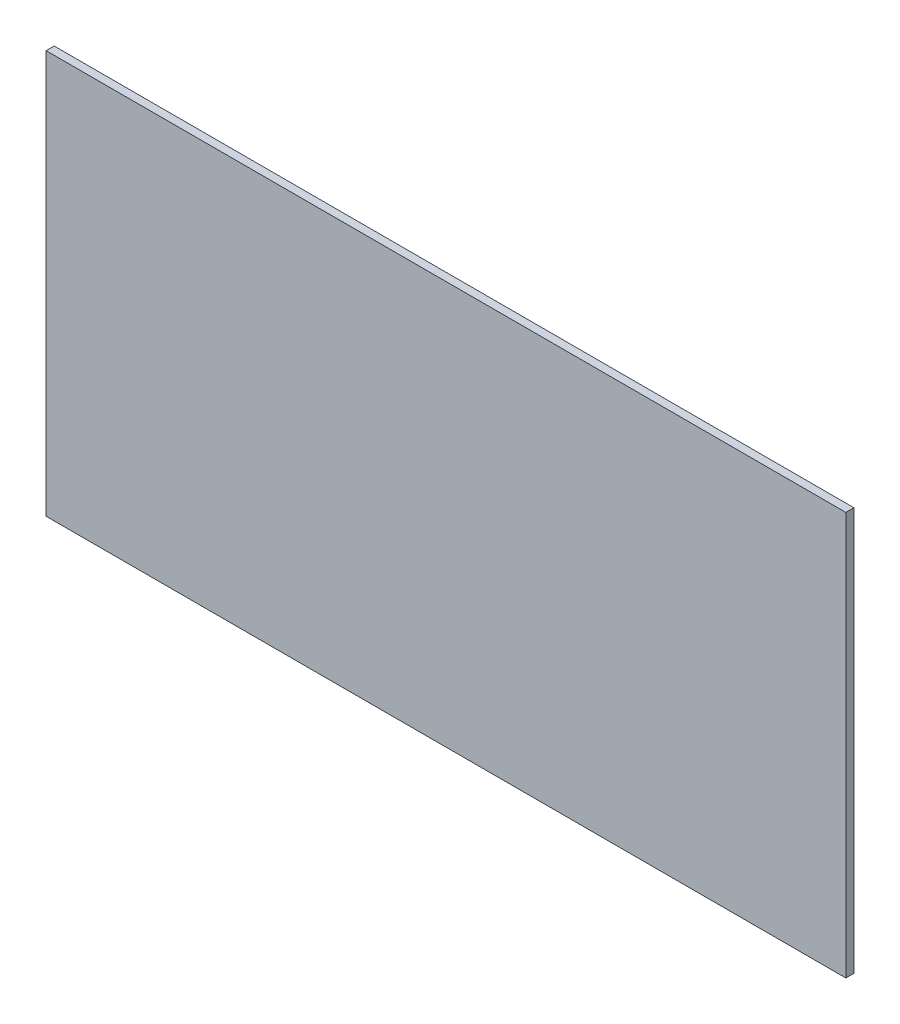
ISO-10303-21;
HEADER;
FILE_DESCRIPTION(('STEP AP214'),'2;1');
FILE_NAME('part.step','',(''),(''),'','','');
FILE_SCHEMA(('AUTOMOTIVE_DESIGN { 1 0 10303 214 1 1 1 1 }'));
ENDSEC;
DATA;
#1=APPLICATION_CONTEXT('core data for automotive mechanical design processes');
#2=APPLICATION_PROTOCOL_DEFINITION('international standard','automotive_design',2000,#1);
#3=PRODUCT_CONTEXT('',#1,'mechanical');
#4=PRODUCT('Part','Part','',(#3));
#5=PRODUCT_RELATED_PRODUCT_CATEGORY('part','',(#4));
#6=PRODUCT_DEFINITION_FORMATION('','',#4);
#7=PRODUCT_DEFINITION_CONTEXT('part definition',#1,'design');
#8=PRODUCT_DEFINITION('design','',#6,#7);
#9=PRODUCT_DEFINITION_SHAPE('','',#8);
#10=(LENGTH_UNIT() NAMED_UNIT(*) SI_UNIT(.MILLI.,.METRE.));
#11=(NAMED_UNIT(*) PLANE_ANGLE_UNIT() SI_UNIT($,.RADIAN.));
#12=(NAMED_UNIT(*) SI_UNIT($,.STERADIAN.) SOLID_ANGLE_UNIT());
#13=UNCERTAINTY_MEASURE_WITH_UNIT(LENGTH_MEASURE(1.E-05),#10,'distance_accuracy_value','');
#14=(GEOMETRIC_REPRESENTATION_CONTEXT(3) GLOBAL_UNCERTAINTY_ASSIGNED_CONTEXT((#13)) GLOBAL_UNIT_ASSIGNED_CONTEXT((#10,
#11,#12)) REPRESENTATION_CONTEXT('',''));
#15=CARTESIAN_POINT('',(0.,0.,0.));
#16=DIRECTION('',(0.,0.,1.));
#17=DIRECTION('',(1.,0.,0.));
#18=AXIS2_PLACEMENT_3D('',#15,#16,#17);
#19=CARTESIAN_POINT('',(297.5,150.,6.));
#20=DIRECTION('',(-1.,0.,0.));
#21=DIRECTION('',(0.,0.,1.));
#22=AXIS2_PLACEMENT_3D('',#19,#20,#21);
#23=PLANE('',#22);
#24=DIRECTION('',(0.,1.,0.));
#25=VECTOR('',#24,1.);
#26=CARTESIAN_POINT('',(297.5,150.,0.));
#27=LINE('',#26,#25);
#28=CARTESIAN_POINT('',(297.5,-150.,0.));
#29=VERTEX_POINT('',#28);
#30=CARTESIAN_POINT('',(297.5,150.,0.));
#31=VERTEX_POINT('',#30);
#32=EDGE_CURVE('E100',#29,#31,#27,.T.);
#33=ORIENTED_EDGE('',*,*,#32,.T.);
#34=DIRECTION('',(0.,0.,-1.));
#35=VECTOR('',#34,1.);
#36=CARTESIAN_POINT('',(297.5,150.,6.));
#37=LINE('',#36,#35);
#38=CARTESIAN_POINT('',(297.5,150.,6.));
#39=VERTEX_POINT('',#38);
#40=EDGE_CURVE('E11',#39,#31,#37,.T.);
#41=ORIENTED_EDGE('',*,*,#40,.F.);
#42=DIRECTION('',(0.,1.,0.));
#43=VECTOR('',#42,1.);
#44=CARTESIAN_POINT('',(297.5,150.,6.));
#45=LINE('',#44,#43);
#46=CARTESIAN_POINT('',(297.5,-150.,6.));
#47=VERTEX_POINT('',#46);
#48=EDGE_CURVE('E88',#47,#39,#45,.T.);
#49=ORIENTED_EDGE('',*,*,#48,.F.);
#50=DIRECTION('',(0.,0.,-1.));
#51=VECTOR('',#50,1.);
#52=CARTESIAN_POINT('',(297.5,-150.,6.));
#53=LINE('',#52,#51);
#54=EDGE_CURVE('E96',#47,#29,#53,.T.);
#55=ORIENTED_EDGE('',*,*,#54,.T.);
#56=EDGE_LOOP('',(#33,#41,#49,#55));
#57=FACE_BOUND('',#56,.T.);
#58=ADVANCED_FACE('F37',(#57),#23,.F.);
#59=CARTESIAN_POINT('',(-297.5,150.,6.));
#60=DIRECTION('',(0.,-1.,0.));
#61=DIRECTION('',(0.,0.,-1.));
#62=AXIS2_PLACEMENT_3D('',#59,#60,#61);
#63=PLANE('',#62);
#64=DIRECTION('',(-1.,0.,0.));
#65=VECTOR('',#64,1.);
#66=CARTESIAN_POINT('',(-297.5,150.,0.));
#67=LINE('',#66,#65);
#68=CARTESIAN_POINT('',(-297.5,150.,0.));
#69=VERTEX_POINT('',#68);
#70=EDGE_CURVE('E92',#31,#69,#67,.T.);
#71=ORIENTED_EDGE('',*,*,#70,.T.);
#72=DIRECTION('',(0.,0.,-1.));
#73=VECTOR('',#72,1.);
#74=CARTESIAN_POINT('',(-297.5,150.,6.));
#75=LINE('',#74,#73);
#76=CARTESIAN_POINT('',(-297.5,150.,6.));
#77=VERTEX_POINT('',#76);
#78=EDGE_CURVE('E45',#77,#69,#75,.T.);
#79=ORIENTED_EDGE('',*,*,#78,.F.);
#80=DIRECTION('',(-1.,0.,0.));
#81=VECTOR('',#80,1.);
#82=CARTESIAN_POINT('',(-297.5,150.,6.));
#83=LINE('',#82,#81);
#84=EDGE_CURVE('E83',#39,#77,#83,.T.);
#85=ORIENTED_EDGE('',*,*,#84,.F.);
#86=ORIENTED_EDGE('',*,*,#40,.T.);
#87=EDGE_LOOP('',(#71,#79,#85,#86));
#88=FACE_BOUND('',#87,.T.);
#89=ADVANCED_FACE('F91',(#88),#63,.F.);
#90=CARTESIAN_POINT('',(-297.5,150.,6.));
#91=DIRECTION('',(1.,0.,0.));
#92=DIRECTION('',(0.,0.,-1.));
#93=AXIS2_PLACEMENT_3D('',#90,#91,#92);
#94=PLANE('',#93);
#95=DIRECTION('',(0.,-1.,0.));
#96=VECTOR('',#95,1.);
#97=CARTESIAN_POINT('',(-297.5,150.,0.));
#98=LINE('',#97,#96);
#99=CARTESIAN_POINT('',(-297.5,-150.,0.));
#100=VERTEX_POINT('',#99);
#101=EDGE_CURVE('E70',#69,#100,#98,.T.);
#102=ORIENTED_EDGE('',*,*,#101,.T.);
#103=DIRECTION('',(0.,0.,-1.));
#104=VECTOR('',#103,1.);
#105=CARTESIAN_POINT('',(-297.5,-150.,6.));
#106=LINE('',#105,#104);
#107=CARTESIAN_POINT('',(-297.5,-150.,6.));
#108=VERTEX_POINT('',#107);
#109=EDGE_CURVE('E93',#108,#100,#106,.T.);
#110=ORIENTED_EDGE('',*,*,#109,.F.);
#111=DIRECTION('',(0.,-1.,0.));
#112=VECTOR('',#111,1.);
#113=CARTESIAN_POINT('',(-297.5,150.,6.));
#114=LINE('',#113,#112);
#115=EDGE_CURVE('E86',#77,#108,#114,.T.);
#116=ORIENTED_EDGE('',*,*,#115,.F.);
#117=ORIENTED_EDGE('',*,*,#78,.T.);
#118=EDGE_LOOP('',(#102,#110,#116,#117));
#119=FACE_BOUND('',#118,.T.);
#120=ADVANCED_FACE('F94',(#119),#94,.F.);
#121=CARTESIAN_POINT('',(-297.5,-150.,6.));
#122=DIRECTION('',(0.,1.,0.));
#123=DIRECTION('',(0.,0.,1.));
#124=AXIS2_PLACEMENT_3D('',#121,#122,#123);
#125=PLANE('',#124);
#126=DIRECTION('',(1.,0.,0.));
#127=VECTOR('',#126,1.);
#128=CARTESIAN_POINT('',(-297.5,-150.,0.));
#129=LINE('',#128,#127);
#130=EDGE_CURVE('E76',#100,#29,#129,.T.);
#131=ORIENTED_EDGE('',*,*,#130,.T.);
#132=ORIENTED_EDGE('',*,*,#54,.F.);
#133=DIRECTION('',(1.,0.,0.));
#134=VECTOR('',#133,1.);
#135=CARTESIAN_POINT('',(-297.5,-150.,6.));
#136=LINE('',#135,#134);
#137=EDGE_CURVE('E53',#108,#47,#136,.T.);
#138=ORIENTED_EDGE('',*,*,#137,.F.);
#139=ORIENTED_EDGE('',*,*,#109,.T.);
#140=EDGE_LOOP('',(#131,#132,#138,#139));
#141=FACE_BOUND('',#140,.T.);
#142=ADVANCED_FACE('F107',(#141),#125,.F.);
#143=CARTESIAN_POINT('',(0.,0.,6.));
#144=DIRECTION('',(0.,0.,1.));
#145=DIRECTION('',(1.,0.,0.));
#146=AXIS2_PLACEMENT_3D('',#143,#144,#145);
#147=PLANE('',#146);
#148=ORIENTED_EDGE('',*,*,#48,.T.);
#149=ORIENTED_EDGE('',*,*,#84,.T.);
#150=ORIENTED_EDGE('',*,*,#115,.T.);
#151=ORIENTED_EDGE('',*,*,#137,.T.);
#152=EDGE_LOOP('',(#148,#149,#150,#151));
#153=FACE_BOUND('',#152,.T.);
#154=ADVANCED_FACE('F84',(#153),#147,.T.);
#155=CARTESIAN_POINT('',(0.,0.,0.));
#156=DIRECTION('',(0.,0.,1.));
#157=DIRECTION('',(1.,0.,0.));
#158=AXIS2_PLACEMENT_3D('',#155,#156,#157);
#159=PLANE('',#158);
#160=ORIENTED_EDGE('',*,*,#32,.F.);
#161=ORIENTED_EDGE('',*,*,#130,.F.);
#162=ORIENTED_EDGE('',*,*,#101,.F.);
#163=ORIENTED_EDGE('',*,*,#70,.F.);
#164=EDGE_LOOP('',(#160,#161,#162,#163));
#165=FACE_BOUND('',#164,.T.);
#166=ADVANCED_FACE('F110',(#165),#159,.F.);
#167=CLOSED_SHELL('',(#58,#89,#120,#142,#154,#166));
#168=MANIFOLD_SOLID_BREP('B2',#167);
#169=ADVANCED_BREP_SHAPE_REPRESENTATION('',(#18,#168),#14);
#170=SHAPE_DEFINITION_REPRESENTATION(#9,#169);
ENDSEC;
END-ISO-10303-21;
